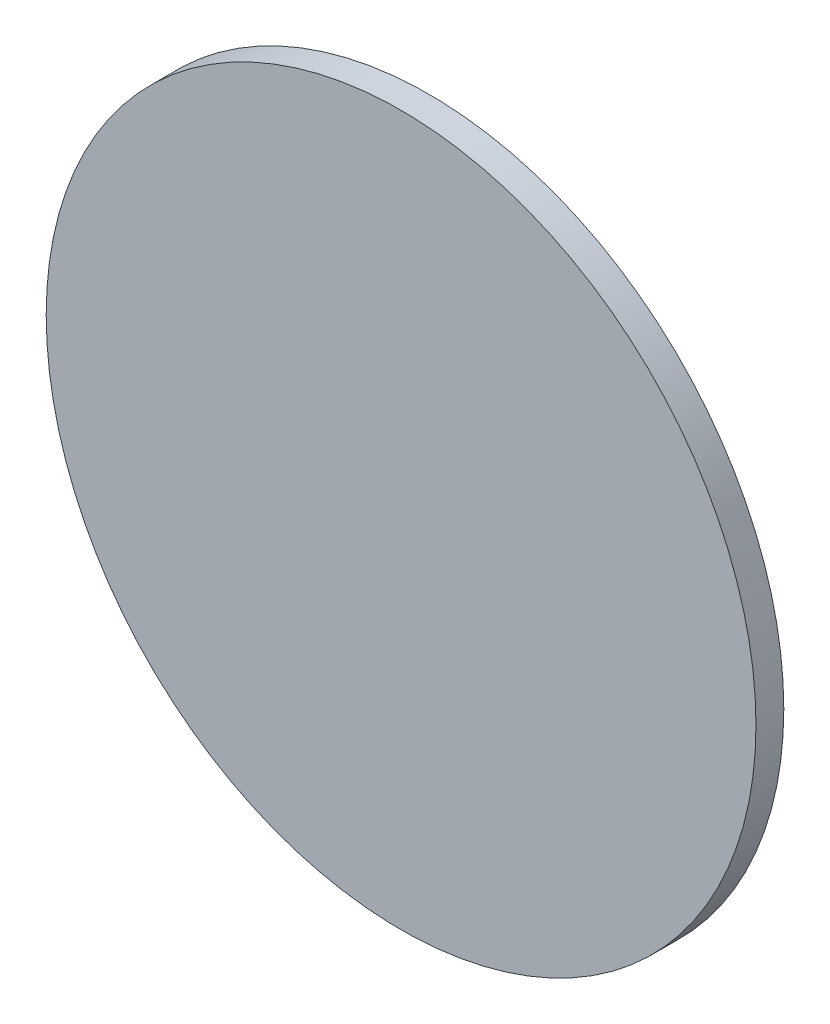
ISO-10303-21;
HEADER;
FILE_DESCRIPTION(('STEP AP214'),'2;1');
FILE_NAME('part.step','',(''),(''),'','','');
FILE_SCHEMA(('AUTOMOTIVE_DESIGN { 1 0 10303 214 1 1 1 1 }'));
ENDSEC;
DATA;
#1=APPLICATION_CONTEXT('core data for automotive mechanical design processes');
#2=APPLICATION_PROTOCOL_DEFINITION('international standard','automotive_design',2000,#1);
#3=PRODUCT_CONTEXT('',#1,'mechanical');
#4=PRODUCT('Part','Part','',(#3));
#5=PRODUCT_RELATED_PRODUCT_CATEGORY('part','',(#4));
#6=PRODUCT_DEFINITION_FORMATION('','',#4);
#7=PRODUCT_DEFINITION_CONTEXT('part definition',#1,'design');
#8=PRODUCT_DEFINITION('design','',#6,#7);
#9=PRODUCT_DEFINITION_SHAPE('','',#8);
#10=(LENGTH_UNIT() NAMED_UNIT(*) SI_UNIT(.MILLI.,.METRE.));
#11=(NAMED_UNIT(*) PLANE_ANGLE_UNIT() SI_UNIT($,.RADIAN.));
#12=(NAMED_UNIT(*) SI_UNIT($,.STERADIAN.) SOLID_ANGLE_UNIT());
#13=UNCERTAINTY_MEASURE_WITH_UNIT(LENGTH_MEASURE(1.E-05),#10,'distance_accuracy_value','');
#14=(GEOMETRIC_REPRESENTATION_CONTEXT(3) GLOBAL_UNCERTAINTY_ASSIGNED_CONTEXT((#13)) GLOBAL_UNIT_ASSIGNED_CONTEXT((#10,
#11,#12)) REPRESENTATION_CONTEXT('',''));
#15=CARTESIAN_POINT('',(0.,0.,0.));
#16=DIRECTION('',(0.,0.,1.));
#17=DIRECTION('',(1.,0.,0.));
#18=AXIS2_PLACEMENT_3D('',#15,#16,#17);
#19=CARTESIAN_POINT('',(0.,0.,10.));
#20=DIRECTION('',(0.,0.,-1.));
#21=DIRECTION('',(-1.,0.,0.));
#22=AXIS2_PLACEMENT_3D('',#19,#20,#21);
#23=CYLINDRICAL_SURFACE('',#22,127.5);
#24=CARTESIAN_POINT('',(0.,0.,10.));
#25=DIRECTION('',(0.,0.,1.));
#26=DIRECTION('',(1.,0.,0.));
#27=AXIS2_PLACEMENT_3D('',#24,#25,#26);
#28=CIRCLE('',#27,127.5);
#29=CARTESIAN_POINT('',(127.5,0.,10.));
#30=VERTEX_POINT('',#29);
#31=EDGE_CURVE('E10',#30,#30,#28,.T.);
#32=ORIENTED_EDGE('',*,*,#31,.F.);
#33=EDGE_LOOP('',(#32));
#34=FACE_BOUND('',#33,.T.);
#35=CARTESIAN_POINT('',(0.,0.,0.));
#36=DIRECTION('',(0.,0.,1.));
#37=DIRECTION('',(1.,0.,0.));
#38=AXIS2_PLACEMENT_3D('',#35,#36,#37);
#39=CIRCLE('',#38,127.5);
#40=CARTESIAN_POINT('',(127.5,0.,0.));
#41=VERTEX_POINT('',#40);
#42=EDGE_CURVE('E46',#41,#41,#39,.T.);
#43=ORIENTED_EDGE('',*,*,#42,.T.);
#44=EDGE_LOOP('',(#43));
#45=FACE_BOUND('',#44,.T.);
#46=ADVANCED_FACE('F43',(#34,#45),#23,.T.);
#47=CARTESIAN_POINT('',(0.,0.,10.));
#48=DIRECTION('',(0.,0.,1.));
#49=DIRECTION('',(1.,0.,0.));
#50=AXIS2_PLACEMENT_3D('',#47,#48,#49);
#51=PLANE('',#50);
#52=ORIENTED_EDGE('',*,*,#31,.T.);
#53=EDGE_LOOP('',(#52));
#54=FACE_BOUND('',#53,.T.);
#55=ADVANCED_FACE('F60',(#54),#51,.T.);
#56=CARTESIAN_POINT('',(0.,0.,0.));
#57=DIRECTION('',(0.,0.,1.));
#58=DIRECTION('',(1.,0.,0.));
#59=AXIS2_PLACEMENT_3D('',#56,#57,#58);
#60=PLANE('',#59);
#61=ORIENTED_EDGE('',*,*,#42,.F.);
#62=EDGE_LOOP('',(#61));
#63=FACE_BOUND('',#62,.T.);
#64=ADVANCED_FACE('F58',(#63),#60,.F.);
#65=CLOSED_SHELL('',(#46,#55,#64));
#66=MANIFOLD_SOLID_BREP('B2',#65);
#67=ADVANCED_BREP_SHAPE_REPRESENTATION('',(#18,#66),#14);
#68=SHAPE_DEFINITION_REPRESENTATION(#9,#67);
ENDSEC;
END-ISO-10303-21;
